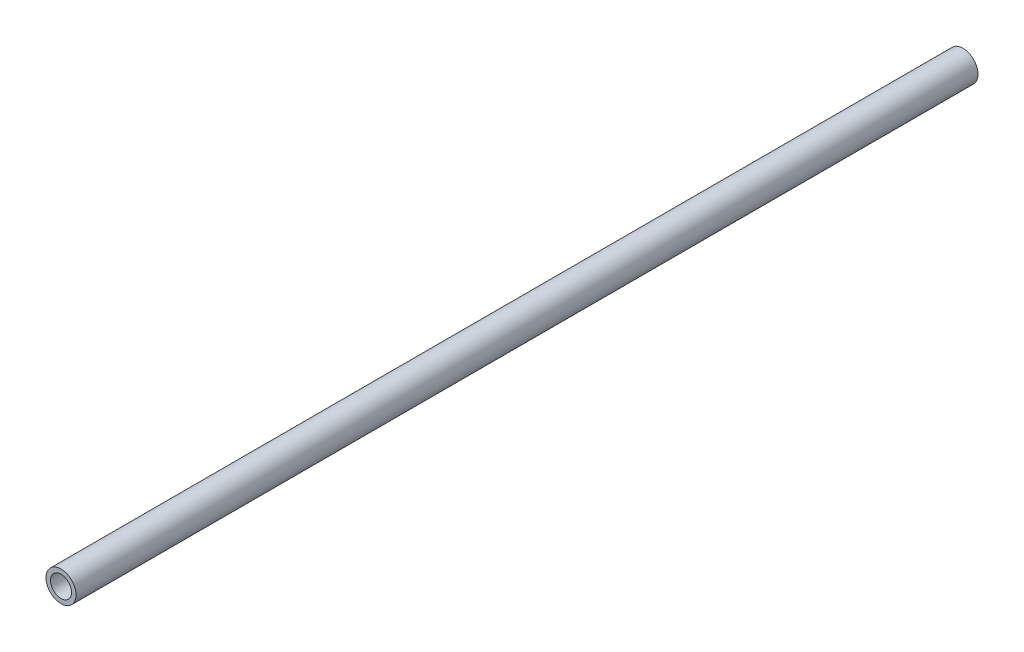
ISO-10303-21;
HEADER;
FILE_DESCRIPTION(('STEP AP214'),'2;1');
FILE_NAME('part.step','',(''),(''),'','','');
FILE_SCHEMA(('AUTOMOTIVE_DESIGN { 1 0 10303 214 1 1 1 1 }'));
ENDSEC;
DATA;
#1=APPLICATION_CONTEXT('core data for automotive mechanical design processes');
#2=APPLICATION_PROTOCOL_DEFINITION('international standard','automotive_design',2000,#1);
#3=PRODUCT_CONTEXT('',#1,'mechanical');
#4=PRODUCT('Part','Part','',(#3));
#5=PRODUCT_RELATED_PRODUCT_CATEGORY('part','',(#4));
#6=PRODUCT_DEFINITION_FORMATION('','',#4);
#7=PRODUCT_DEFINITION_CONTEXT('part definition',#1,'design');
#8=PRODUCT_DEFINITION('design','',#6,#7);
#9=PRODUCT_DEFINITION_SHAPE('','',#8);
#10=(LENGTH_UNIT() NAMED_UNIT(*) SI_UNIT(.MILLI.,.METRE.));
#11=(NAMED_UNIT(*) PLANE_ANGLE_UNIT() SI_UNIT($,.RADIAN.));
#12=(NAMED_UNIT(*) SI_UNIT($,.STERADIAN.) SOLID_ANGLE_UNIT());
#13=UNCERTAINTY_MEASURE_WITH_UNIT(LENGTH_MEASURE(1.E-05),#10,'distance_accuracy_value','');
#14=(GEOMETRIC_REPRESENTATION_CONTEXT(3) GLOBAL_UNCERTAINTY_ASSIGNED_CONTEXT((#13)) GLOBAL_UNIT_ASSIGNED_CONTEXT((#10,
#11,#12)) REPRESENTATION_CONTEXT('',''));
#15=CARTESIAN_POINT('',(0.,0.,0.));
#16=DIRECTION('',(0.,0.,1.));
#17=DIRECTION('',(1.,0.,0.));
#18=AXIS2_PLACEMENT_3D('',#15,#16,#17);
#19=CARTESIAN_POINT('',(0.,0.,1500.));
#20=DIRECTION('',(0.,0.,1.));
#21=DIRECTION('',(1.,0.,0.));
#22=AXIS2_PLACEMENT_3D('',#19,#20,#21);
#23=PLANE('',#22);
#24=CARTESIAN_POINT('',(0.,0.,1500.));
#25=DIRECTION('',(0.,0.,1.));
#26=DIRECTION('',(1.,0.,0.));
#27=AXIS2_PLACEMENT_3D('',#24,#25,#26);
#28=CIRCLE('',#27,25.);
#29=CARTESIAN_POINT('',(25.,0.,1500.));
#30=VERTEX_POINT('',#29);
#31=EDGE_CURVE('E10',#30,#30,#28,.T.);
#32=ORIENTED_EDGE('',*,*,#31,.T.);
#33=EDGE_LOOP('',(#32));
#34=FACE_BOUND('',#33,.T.);
#35=CARTESIAN_POINT('',(0.,0.,1500.));
#36=DIRECTION('',(0.,0.,1.));
#37=DIRECTION('',(1.,0.,0.));
#38=AXIS2_PLACEMENT_3D('',#35,#36,#37);
#39=CIRCLE('',#38,17.5);
#40=CARTESIAN_POINT('',(17.5,0.,1500.));
#41=VERTEX_POINT('',#40);
#42=EDGE_CURVE('E50',#41,#41,#39,.T.);
#43=ORIENTED_EDGE('',*,*,#42,.F.);
#44=EDGE_LOOP('',(#43));
#45=FACE_BOUND('',#44,.T.);
#46=ADVANCED_FACE('F37',(#34,#45),#23,.T.);
#47=CARTESIAN_POINT('',(0.,0.,0.));
#48=DIRECTION('',(0.,0.,1.));
#49=DIRECTION('',(1.,0.,0.));
#50=AXIS2_PLACEMENT_3D('',#47,#48,#49);
#51=PLANE('',#50);
#52=CARTESIAN_POINT('',(0.,0.,0.));
#53=DIRECTION('',(0.,0.,1.));
#54=DIRECTION('',(1.,0.,0.));
#55=AXIS2_PLACEMENT_3D('',#52,#53,#54);
#56=CIRCLE('',#55,25.);
#57=CARTESIAN_POINT('',(25.,0.,0.));
#58=VERTEX_POINT('',#57);
#59=EDGE_CURVE('E41',#58,#58,#56,.T.);
#60=ORIENTED_EDGE('',*,*,#59,.F.);
#61=EDGE_LOOP('',(#60));
#62=FACE_BOUND('',#61,.T.);
#63=CARTESIAN_POINT('',(0.,0.,0.));
#64=DIRECTION('',(0.,0.,1.));
#65=DIRECTION('',(1.,0.,0.));
#66=AXIS2_PLACEMENT_3D('',#63,#64,#65);
#67=CIRCLE('',#66,17.5);
#68=CARTESIAN_POINT('',(17.5,0.,0.));
#69=VERTEX_POINT('',#68);
#70=EDGE_CURVE('E52',#69,#69,#67,.T.);
#71=ORIENTED_EDGE('',*,*,#70,.T.);
#72=EDGE_LOOP('',(#71));
#73=FACE_BOUND('',#72,.T.);
#74=ADVANCED_FACE('F64',(#62,#73),#51,.F.);
#75=CARTESIAN_POINT('',(0.,0.,1500.));
#76=DIRECTION('',(0.,0.,-1.));
#77=DIRECTION('',(-1.,0.,0.));
#78=AXIS2_PLACEMENT_3D('',#75,#76,#77);
#79=CYLINDRICAL_SURFACE('',#78,25.);
#80=ORIENTED_EDGE('',*,*,#31,.F.);
#81=EDGE_LOOP('',(#80));
#82=FACE_BOUND('',#81,.T.);
#83=ORIENTED_EDGE('',*,*,#59,.T.);
#84=EDGE_LOOP('',(#83));
#85=FACE_BOUND('',#84,.T.);
#86=ADVANCED_FACE('F39',(#82,#85),#79,.T.);
#87=CARTESIAN_POINT('',(0.,0.,1500.));
#88=DIRECTION('',(0.,0.,-1.));
#89=DIRECTION('',(-1.,0.,0.));
#90=AXIS2_PLACEMENT_3D('',#87,#88,#89);
#91=CYLINDRICAL_SURFACE('',#90,17.5);
#92=ORIENTED_EDGE('',*,*,#42,.T.);
#93=EDGE_LOOP('',(#92));
#94=FACE_BOUND('',#93,.T.);
#95=ORIENTED_EDGE('',*,*,#70,.F.);
#96=EDGE_LOOP('',(#95));
#97=FACE_BOUND('',#96,.T.);
#98=ADVANCED_FACE('F60',(#94,#97),#91,.F.);
#99=CLOSED_SHELL('',(#46,#74,#86,#98));
#100=MANIFOLD_SOLID_BREP('B2',#99);
#101=ADVANCED_BREP_SHAPE_REPRESENTATION('',(#18,#100),#14);
#102=SHAPE_DEFINITION_REPRESENTATION(#9,#101);
ENDSEC;
END-ISO-10303-21;
